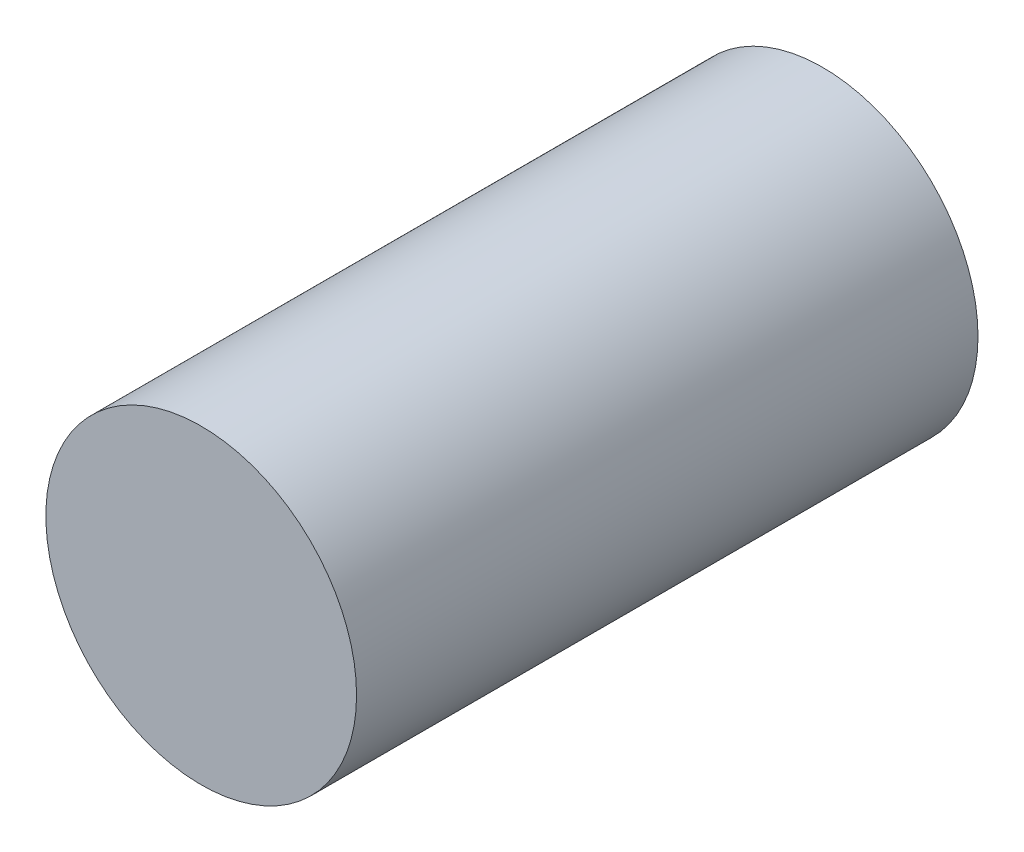
ISO-10303-21;
HEADER;
FILE_DESCRIPTION(('STEP AP214'),'2;1');
FILE_NAME('part.step','',(''),(''),'','','');
FILE_SCHEMA(('AUTOMOTIVE_DESIGN { 1 0 10303 214 1 1 1 1 }'));
ENDSEC;
DATA;
#1=APPLICATION_CONTEXT('core data for automotive mechanical design processes');
#2=APPLICATION_PROTOCOL_DEFINITION('international standard','automotive_design',2000,#1);
#3=PRODUCT_CONTEXT('',#1,'mechanical');
#4=PRODUCT('Part','Part','',(#3));
#5=PRODUCT_RELATED_PRODUCT_CATEGORY('part','',(#4));
#6=PRODUCT_DEFINITION_FORMATION('','',#4);
#7=PRODUCT_DEFINITION_CONTEXT('part definition',#1,'design');
#8=PRODUCT_DEFINITION('design','',#6,#7);
#9=PRODUCT_DEFINITION_SHAPE('','',#8);
#10=(LENGTH_UNIT() NAMED_UNIT(*) SI_UNIT(.MILLI.,.METRE.));
#11=(NAMED_UNIT(*) PLANE_ANGLE_UNIT() SI_UNIT($,.RADIAN.));
#12=(NAMED_UNIT(*) SI_UNIT($,.STERADIAN.) SOLID_ANGLE_UNIT());
#13=UNCERTAINTY_MEASURE_WITH_UNIT(LENGTH_MEASURE(1.E-05),#10,'distance_accuracy_value','');
#14=(GEOMETRIC_REPRESENTATION_CONTEXT(3) GLOBAL_UNCERTAINTY_ASSIGNED_CONTEXT((#13)) GLOBAL_UNIT_ASSIGNED_CONTEXT((#10,
#11,#12)) REPRESENTATION_CONTEXT('',''));
#15=CARTESIAN_POINT('',(0.,0.,0.));
#16=DIRECTION('',(0.,0.,1.));
#17=DIRECTION('',(1.,0.,0.));
#18=AXIS2_PLACEMENT_3D('',#15,#16,#17);
#19=CARTESIAN_POINT('',(0.,0.,30.));
#20=DIRECTION('',(0.,0.,-1.));
#21=DIRECTION('',(-1.,0.,0.));
#22=AXIS2_PLACEMENT_3D('',#19,#20,#21);
#23=CYLINDRICAL_SURFACE('',#22,7.5);
#24=CARTESIAN_POINT('',(0.,0.,30.));
#25=DIRECTION('',(0.,0.,1.));
#26=DIRECTION('',(1.,0.,0.));
#27=AXIS2_PLACEMENT_3D('',#24,#25,#26);
#28=CIRCLE('',#27,7.5);
#29=CARTESIAN_POINT('',(7.5,0.,30.));
#30=VERTEX_POINT('',#29);
#31=EDGE_CURVE('E10',#30,#30,#28,.T.);
#32=ORIENTED_EDGE('',*,*,#31,.F.);
#33=EDGE_LOOP('',(#32));
#34=FACE_BOUND('',#33,.T.);
#35=CARTESIAN_POINT('',(0.,0.,0.));
#36=DIRECTION('',(0.,0.,1.));
#37=DIRECTION('',(1.,0.,0.));
#38=AXIS2_PLACEMENT_3D('',#35,#36,#37);
#39=CIRCLE('',#38,7.5);
#40=CARTESIAN_POINT('',(7.5,0.,0.));
#41=VERTEX_POINT('',#40);
#42=EDGE_CURVE('E40',#41,#41,#39,.T.);
#43=ORIENTED_EDGE('',*,*,#42,.T.);
#44=EDGE_LOOP('',(#43));
#45=FACE_BOUND('',#44,.T.);
#46=ADVANCED_FACE('F37',(#34,#45),#23,.T.);
#47=CARTESIAN_POINT('',(0.,0.,30.));
#48=DIRECTION('',(0.,0.,1.));
#49=DIRECTION('',(1.,0.,0.));
#50=AXIS2_PLACEMENT_3D('',#47,#48,#49);
#51=PLANE('',#50);
#52=ORIENTED_EDGE('',*,*,#31,.T.);
#53=EDGE_LOOP('',(#52));
#54=FACE_BOUND('',#53,.T.);
#55=ADVANCED_FACE('F52',(#54),#51,.T.);
#56=CARTESIAN_POINT('',(0.,0.,0.));
#57=DIRECTION('',(0.,0.,1.));
#58=DIRECTION('',(1.,0.,0.));
#59=AXIS2_PLACEMENT_3D('',#56,#57,#58);
#60=PLANE('',#59);
#61=ORIENTED_EDGE('',*,*,#42,.F.);
#62=EDGE_LOOP('',(#61));
#63=FACE_BOUND('',#62,.T.);
#64=ADVANCED_FACE('F50',(#63),#60,.F.);
#65=CLOSED_SHELL('',(#46,#55,#64));
#66=MANIFOLD_SOLID_BREP('B2',#65);
#67=ADVANCED_BREP_SHAPE_REPRESENTATION('',(#18,#66),#14);
#68=SHAPE_DEFINITION_REPRESENTATION(#9,#67);
ENDSEC;
END-ISO-10303-21;
